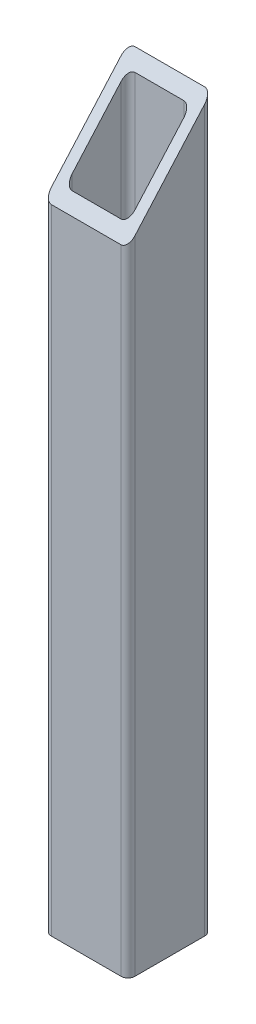
ISO-10303-21;
HEADER;
FILE_DESCRIPTION(('STEP AP214'),'2;1');
FILE_NAME('part.step','',(''),(''),'','','');
FILE_SCHEMA(('AUTOMOTIVE_DESIGN { 1 0 10303 214 1 1 1 1 }'));
ENDSEC;
DATA;
#1=APPLICATION_CONTEXT('core data for automotive mechanical design processes');
#2=APPLICATION_PROTOCOL_DEFINITION('international standard','automotive_design',2000,#1);
#3=PRODUCT_CONTEXT('',#1,'mechanical');
#4=PRODUCT('Part','Part','',(#3));
#5=PRODUCT_RELATED_PRODUCT_CATEGORY('part','',(#4));
#6=PRODUCT_DEFINITION_FORMATION('','',#4);
#7=PRODUCT_DEFINITION_CONTEXT('part definition',#1,'design');
#8=PRODUCT_DEFINITION('design','',#6,#7);
#9=PRODUCT_DEFINITION_SHAPE('','',#8);
#10=(LENGTH_UNIT() NAMED_UNIT(*) SI_UNIT(.MILLI.,.METRE.));
#11=(NAMED_UNIT(*) PLANE_ANGLE_UNIT() SI_UNIT($,.RADIAN.));
#12=(NAMED_UNIT(*) SI_UNIT($,.STERADIAN.) SOLID_ANGLE_UNIT());
#13=UNCERTAINTY_MEASURE_WITH_UNIT(LENGTH_MEASURE(1.E-05),#10,'distance_accuracy_value','');
#14=(GEOMETRIC_REPRESENTATION_CONTEXT(3) GLOBAL_UNCERTAINTY_ASSIGNED_CONTEXT((#13)) GLOBAL_UNIT_ASSIGNED_CONTEXT((#10,
#11,#12)) REPRESENTATION_CONTEXT('',''));
#15=CARTESIAN_POINT('',(0.,0.,0.));
#16=DIRECTION('',(0.,0.,1.));
#17=DIRECTION('',(1.,0.,0.));
#18=AXIS2_PLACEMENT_3D('',#15,#16,#17);
#19=CARTESIAN_POINT('',(-12.7,1219.2,12.7));
#20=DIRECTION('',(1.,0.,0.));
#21=DIRECTION('',(0.,0.,-1.));
#22=AXIS2_PLACEMENT_3D('',#19,#20,#21);
#23=PLANE('',#22);
#24=DIRECTION('',(0.,-1.,0.));
#25=VECTOR('',#24,1.);
#26=CARTESIAN_POINT('',(-12.7,1219.2,10.5918));
#27=LINE('',#26,#25);
#28=CARTESIAN_POINT('',(-12.7,0.,10.5918));
#29=VERTEX_POINT('',#28);
#30=CARTESIAN_POINT('',(-12.7,194.680595204069,10.5917999999999));
#31=VERTEX_POINT('',#30);
#32=EDGE_CURVE('E176',#29,#31,#27,.F.);
#33=ORIENTED_EDGE('',*,*,#32,.T.);
#34=DIRECTION('',(0.,0.75,-0.661437827766148));
#35=VECTOR('',#34,1.);
#36=CARTESIAN_POINT('',(-12.7,-9.61997822454396,190.76797));
#37=LINE('',#36,#35);
#38=CARTESIAN_POINT('',(-12.7,218.700539835383,-10.5917999999999));
#39=VERTEX_POINT('',#38);
#40=EDGE_CURVE('E168',#31,#39,#37,.T.);
#41=ORIENTED_EDGE('',*,*,#40,.T.);
#42=DIRECTION('',(0.,-1.,0.));
#43=VECTOR('',#42,1.);
#44=CARTESIAN_POINT('',(-12.7,1219.2,-10.5918));
#45=LINE('',#44,#43);
#46=CARTESIAN_POINT('',(-12.7,0.,-10.5918));
#47=VERTEX_POINT('',#46);
#48=EDGE_CURVE('E186',#39,#47,#45,.T.);
#49=ORIENTED_EDGE('',*,*,#48,.T.);
#50=DIRECTION('',(0.,0.,1.));
#51=VECTOR('',#50,1.);
#52=CARTESIAN_POINT('',(-12.7,0.,12.7));
#53=LINE('',#52,#51);
#54=EDGE_CURVE('E278',#47,#29,#53,.T.);
#55=ORIENTED_EDGE('',*,*,#54,.T.);
#56=EDGE_LOOP('',(#33,#41,#49,#55));
#57=FACE_BOUND('',#56,.T.);
#58=ADVANCED_FACE('F41',(#57),#23,.F.);
#59=CARTESIAN_POINT('',(12.7,1219.2,12.7));
#60=DIRECTION('',(0.,0.,-1.));
#61=DIRECTION('',(-1.,0.,0.));
#62=AXIS2_PLACEMENT_3D('',#59,#60,#61);
#63=PLANE('',#62);
#64=DIRECTION('',(0.,-1.,0.));
#65=VECTOR('',#64,1.);
#66=CARTESIAN_POINT('',(10.5918,1219.2,12.7));
#67=LINE('',#66,#65);
#68=CARTESIAN_POINT('',(10.5918,0.,12.7));
#69=VERTEX_POINT('',#68);
#70=CARTESIAN_POINT('',(10.5918,192.290121098075,12.7));
#71=VERTEX_POINT('',#70);
#72=EDGE_CURVE('E189',#69,#71,#67,.F.);
#73=ORIENTED_EDGE('',*,*,#72,.T.);
#74=DIRECTION('',(-1.,0.,0.));
#75=VECTOR('',#74,1.);
#76=CARTESIAN_POINT('',(12.7000000000002,192.290121098075,12.7));
#77=LINE('',#76,#75);
#78=CARTESIAN_POINT('',(-10.5918,192.290121098075,12.7));
#79=VERTEX_POINT('',#78);
#80=EDGE_CURVE('E64',#71,#79,#77,.T.);
#81=ORIENTED_EDGE('',*,*,#80,.T.);
#82=DIRECTION('',(0.,-1.,0.));
#83=VECTOR('',#82,1.);
#84=CARTESIAN_POINT('',(-10.5918,1219.2,12.7));
#85=LINE('',#84,#83);
#86=CARTESIAN_POINT('',(-10.5918,0.,12.7));
#87=VERTEX_POINT('',#86);
#88=EDGE_CURVE('E192',#79,#87,#85,.T.);
#89=ORIENTED_EDGE('',*,*,#88,.T.);
#90=DIRECTION('',(1.,0.,0.));
#91=VECTOR('',#90,1.);
#92=CARTESIAN_POINT('',(12.7,0.,12.7));
#93=LINE('',#92,#91);
#94=EDGE_CURVE('E339',#87,#69,#93,.T.);
#95=ORIENTED_EDGE('',*,*,#94,.T.);
#96=EDGE_LOOP('',(#73,#81,#89,#95));
#97=FACE_BOUND('',#96,.T.);
#98=ADVANCED_FACE('F356',(#97),#63,.F.);
#99=CARTESIAN_POINT('',(12.7,1219.2,12.7));
#100=DIRECTION('',(-1.,0.,0.));
#101=DIRECTION('',(0.,0.,1.));
#102=AXIS2_PLACEMENT_3D('',#99,#100,#101);
#103=PLANE('',#102);
#104=DIRECTION('',(0.,-1.,0.));
#105=VECTOR('',#104,1.);
#106=CARTESIAN_POINT('',(12.7,1219.2,-10.5918));
#107=LINE('',#106,#105);
#108=CARTESIAN_POINT('',(12.7,0.,-10.5918));
#109=VERTEX_POINT('',#108);
#110=CARTESIAN_POINT('',(12.7,218.700539835383,-10.5918));
#111=VERTEX_POINT('',#110);
#112=EDGE_CURVE('E166',#109,#111,#107,.F.);
#113=ORIENTED_EDGE('',*,*,#112,.T.);
#114=DIRECTION('',(0.,0.75,-0.661437827766148));
#115=VECTOR('',#114,1.);
#116=CARTESIAN_POINT('',(12.7,218.980021775456,-10.8382799031219));
#117=LINE('',#116,#115);
#118=CARTESIAN_POINT('',(12.7,194.680595204069,10.5918));
#119=VERTEX_POINT('',#118);
#120=EDGE_CURVE('E153',#119,#111,#117,.T.);
#121=ORIENTED_EDGE('',*,*,#120,.F.);
#122=DIRECTION('',(0.,-1.,0.));
#123=VECTOR('',#122,1.);
#124=CARTESIAN_POINT('',(12.7,1219.2,10.5918));
#125=LINE('',#124,#123);
#126=CARTESIAN_POINT('',(12.7,0.,10.5918));
#127=VERTEX_POINT('',#126);
#128=EDGE_CURVE('E163',#119,#127,#125,.T.);
#129=ORIENTED_EDGE('',*,*,#128,.T.);
#130=DIRECTION('',(0.,0.,-1.));
#131=VECTOR('',#130,1.);
#132=CARTESIAN_POINT('',(12.7,0.,12.7));
#133=LINE('',#132,#131);
#134=EDGE_CURVE('E237',#127,#109,#133,.T.);
#135=ORIENTED_EDGE('',*,*,#134,.T.);
#136=EDGE_LOOP('',(#113,#121,#129,#135));
#137=FACE_BOUND('',#136,.T.);
#138=ADVANCED_FACE('F161',(#137),#103,.F.);
#139=CARTESIAN_POINT('',(12.7,1219.2,-12.7));
#140=DIRECTION('',(0.,0.,1.));
#141=DIRECTION('',(1.,0.,0.));
#142=AXIS2_PLACEMENT_3D('',#139,#140,#141);
#143=PLANE('',#142);
#144=DIRECTION('',(0.,-1.,0.));
#145=VECTOR('',#144,1.);
#146=CARTESIAN_POINT('',(-10.5918,1219.2,-12.7));
#147=LINE('',#146,#145);
#148=CARTESIAN_POINT('',(-10.5918,0.,-12.7));
#149=VERTEX_POINT('',#148);
#150=CARTESIAN_POINT('',(-10.5918,221.091013941378,-12.7));
#151=VERTEX_POINT('',#150);
#152=EDGE_CURVE('E261',#149,#151,#147,.F.);
#153=ORIENTED_EDGE('',*,*,#152,.T.);
#154=DIRECTION('',(1.,0.,0.));
#155=VECTOR('',#154,1.);
#156=CARTESIAN_POINT('',(12.7000000000002,221.091013941378,-12.7));
#157=LINE('',#156,#155);
#158=CARTESIAN_POINT('',(10.5918,221.091013941378,-12.7));
#159=VERTEX_POINT('',#158);
#160=EDGE_CURVE('E292',#151,#159,#157,.T.);
#161=ORIENTED_EDGE('',*,*,#160,.T.);
#162=DIRECTION('',(0.,-1.,0.));
#163=VECTOR('',#162,1.);
#164=CARTESIAN_POINT('',(10.5918,1219.2,-12.7));
#165=LINE('',#164,#163);
#166=CARTESIAN_POINT('',(10.5918,0.,-12.7));
#167=VERTEX_POINT('',#166);
#168=EDGE_CURVE('E265',#159,#167,#165,.T.);
#169=ORIENTED_EDGE('',*,*,#168,.T.);
#170=DIRECTION('',(-1.,0.,0.));
#171=VECTOR('',#170,1.);
#172=CARTESIAN_POINT('',(12.7,0.,-12.7));
#173=LINE('',#172,#171);
#174=EDGE_CURVE('E230',#167,#149,#173,.T.);
#175=ORIENTED_EDGE('',*,*,#174,.T.);
#176=EDGE_LOOP('',(#153,#161,#169,#175));
#177=FACE_BOUND('',#176,.T.);
#178=ADVANCED_FACE('F283',(#177),#143,.F.);
#179=CARTESIAN_POINT('',(9.525,1219.2,9.525));
#180=DIRECTION('',(-1.,0.,0.));
#181=DIRECTION('',(0.,0.,1.));
#182=AXIS2_PLACEMENT_3D('',#179,#180,#181);
#183=PLANE('',#182);
#184=DIRECTION('',(0.,-0.75,0.661437827766148));
#185=VECTOR('',#184,1.);
#186=CARTESIAN_POINT('',(9.525,771.501976807776,-498.116842209365));
#187=LINE('',#186,#185);
#188=CARTESIAN_POINT('',(9.525,215.100428229971,-7.41679999999995));
#189=VERTEX_POINT('',#188);
#190=CARTESIAN_POINT('',(9.525,198.280706809482,7.4168));
#191=VERTEX_POINT('',#190);
#192=EDGE_CURVE('E57',#189,#191,#187,.T.);
#193=ORIENTED_EDGE('',*,*,#192,.F.);
#194=DIRECTION('',(0.,-1.,0.));
#195=VECTOR('',#194,1.);
#196=CARTESIAN_POINT('',(9.525,0.,-7.4168));
#197=LINE('',#196,#195);
#198=CARTESIAN_POINT('',(9.525,0.,-7.4168));
#199=VERTEX_POINT('',#198);
#200=EDGE_CURVE('E221',#189,#199,#197,.T.);
#201=ORIENTED_EDGE('',*,*,#200,.T.);
#202=DIRECTION('',(0.,0.,-1.));
#203=VECTOR('',#202,1.);
#204=CARTESIAN_POINT('',(9.525,0.,9.525));
#205=LINE('',#204,#203);
#206=CARTESIAN_POINT('',(9.525,0.,7.4168));
#207=VERTEX_POINT('',#206);
#208=EDGE_CURVE('E210',#207,#199,#205,.T.);
#209=ORIENTED_EDGE('',*,*,#208,.F.);
#210=DIRECTION('',(0.,-1.,0.));
#211=VECTOR('',#210,1.);
#212=CARTESIAN_POINT('',(9.525,1219.2,7.4168));
#213=LINE('',#212,#211);
#214=EDGE_CURVE('E219',#207,#191,#213,.F.);
#215=ORIENTED_EDGE('',*,*,#214,.T.);
#216=EDGE_LOOP('',(#193,#201,#209,#215));
#217=FACE_BOUND('',#216,.T.);
#218=ADVANCED_FACE('F218',(#217),#183,.T.);
#219=CARTESIAN_POINT('',(9.525,1219.2,-9.525));
#220=DIRECTION('',(0.,0.,1.));
#221=DIRECTION('',(1.,0.,0.));
#222=AXIS2_PLACEMENT_3D('',#219,#220,#221);
#223=PLANE('',#222);
#224=DIRECTION('',(1.,0.,0.));
#225=VECTOR('',#224,1.);
#226=CARTESIAN_POINT('',(9.5250000000002,217.490902335965,-9.525));
#227=LINE('',#226,#225);
#228=CARTESIAN_POINT('',(-7.4168,217.490902335965,-9.525));
#229=VERTEX_POINT('',#228);
#230=CARTESIAN_POINT('',(7.4168,217.490902335965,-9.525));
#231=VERTEX_POINT('',#230);
#232=EDGE_CURVE('E322',#229,#231,#227,.T.);
#233=ORIENTED_EDGE('',*,*,#232,.F.);
#234=DIRECTION('',(0.,-1.,0.));
#235=VECTOR('',#234,1.);
#236=CARTESIAN_POINT('',(-7.4168,0.,-9.525));
#237=LINE('',#236,#235);
#238=CARTESIAN_POINT('',(-7.4168,0.,-9.525));
#239=VERTEX_POINT('',#238);
#240=EDGE_CURVE('E234',#229,#239,#237,.T.);
#241=ORIENTED_EDGE('',*,*,#240,.T.);
#242=DIRECTION('',(-1.,0.,0.));
#243=VECTOR('',#242,1.);
#244=CARTESIAN_POINT('',(9.525,0.,-9.525));
#245=LINE('',#244,#243);
#246=CARTESIAN_POINT('',(7.4168,0.,-9.525));
#247=VERTEX_POINT('',#246);
#248=EDGE_CURVE('E224',#247,#239,#245,.T.);
#249=ORIENTED_EDGE('',*,*,#248,.F.);
#250=DIRECTION('',(0.,-1.,0.));
#251=VECTOR('',#250,1.);
#252=CARTESIAN_POINT('',(7.4168,1219.2,-9.525));
#253=LINE('',#252,#251);
#254=EDGE_CURVE('E243',#247,#231,#253,.F.);
#255=ORIENTED_EDGE('',*,*,#254,.T.);
#256=EDGE_LOOP('',(#233,#241,#249,#255));
#257=FACE_BOUND('',#256,.T.);
#258=ADVANCED_FACE('F393',(#257),#223,.T.);
#259=CARTESIAN_POINT('',(-9.525,1219.2,9.525));
#260=DIRECTION('',(1.,0.,0.));
#261=DIRECTION('',(0.,0.,-1.));
#262=AXIS2_PLACEMENT_3D('',#259,#260,#261);
#263=PLANE('',#262);
#264=DIRECTION('',(0.,0.75,-0.661437827766148));
#265=VECTOR('',#264,1.);
#266=CARTESIAN_POINT('',(-9.52499999999996,771.501976807776,-498.116842209365));
#267=LINE('',#266,#265);
#268=CARTESIAN_POINT('',(-9.525,198.280706809482,7.4168));
#269=VERTEX_POINT('',#268);
#270=CARTESIAN_POINT('',(-9.525,215.100428229971,-7.41679999999995));
#271=VERTEX_POINT('',#270);
#272=EDGE_CURVE('E319',#269,#271,#267,.T.);
#273=ORIENTED_EDGE('',*,*,#272,.F.);
#274=DIRECTION('',(0.,-1.,0.));
#275=VECTOR('',#274,1.);
#276=CARTESIAN_POINT('',(-9.525,0.,7.4168));
#277=LINE('',#276,#275);
#278=CARTESIAN_POINT('',(-9.525,0.,7.4168));
#279=VERTEX_POINT('',#278);
#280=EDGE_CURVE('E247',#269,#279,#277,.T.);
#281=ORIENTED_EDGE('',*,*,#280,.T.);
#282=DIRECTION('',(0.,0.,1.));
#283=VECTOR('',#282,1.);
#284=CARTESIAN_POINT('',(-9.525,0.,9.525));
#285=LINE('',#284,#283);
#286=CARTESIAN_POINT('',(-9.525,0.,-7.4168));
#287=VERTEX_POINT('',#286);
#288=EDGE_CURVE('E331',#287,#279,#285,.T.);
#289=ORIENTED_EDGE('',*,*,#288,.F.);
#290=DIRECTION('',(0.,-1.,0.));
#291=VECTOR('',#290,1.);
#292=CARTESIAN_POINT('',(-9.525,1219.2,-7.4168));
#293=LINE('',#292,#291);
#294=EDGE_CURVE('E250',#287,#271,#293,.F.);
#295=ORIENTED_EDGE('',*,*,#294,.T.);
#296=EDGE_LOOP('',(#273,#281,#289,#295));
#297=FACE_BOUND('',#296,.T.);
#298=ADVANCED_FACE('F386',(#297),#263,.T.);
#299=CARTESIAN_POINT('',(9.525,1219.2,9.525));
#300=DIRECTION('',(0.,0.,-1.));
#301=DIRECTION('',(-1.,0.,0.));
#302=AXIS2_PLACEMENT_3D('',#299,#300,#301);
#303=PLANE('',#302);
#304=DIRECTION('',(-1.,0.,0.));
#305=VECTOR('',#304,1.);
#306=CARTESIAN_POINT('',(9.52500000000021,195.890232703488,9.525));
#307=LINE('',#306,#305);
#308=CARTESIAN_POINT('',(7.4168,195.890232703487,9.525));
#309=VERTEX_POINT('',#308);
#310=CARTESIAN_POINT('',(-7.4168,195.890232703488,9.525));
#311=VERTEX_POINT('',#310);
#312=EDGE_CURVE('E306',#309,#311,#307,.T.);
#313=ORIENTED_EDGE('',*,*,#312,.F.);
#314=DIRECTION('',(0.,-1.,0.));
#315=VECTOR('',#314,1.);
#316=CARTESIAN_POINT('',(7.4168,0.,9.525));
#317=LINE('',#316,#315);
#318=CARTESIAN_POINT('',(7.4168,0.,9.525));
#319=VERTEX_POINT('',#318);
#320=EDGE_CURVE('E254',#309,#319,#317,.T.);
#321=ORIENTED_EDGE('',*,*,#320,.T.);
#322=DIRECTION('',(1.,0.,0.));
#323=VECTOR('',#322,1.);
#324=CARTESIAN_POINT('',(9.525,0.,9.525));
#325=LINE('',#324,#323);
#326=CARTESIAN_POINT('',(-7.4168,0.,9.525));
#327=VERTEX_POINT('',#326);
#328=EDGE_CURVE('E212',#327,#319,#325,.T.);
#329=ORIENTED_EDGE('',*,*,#328,.F.);
#330=DIRECTION('',(0.,-1.,0.));
#331=VECTOR('',#330,1.);
#332=CARTESIAN_POINT('',(-7.4168,1219.2,9.525));
#333=LINE('',#332,#331);
#334=EDGE_CURVE('E257',#327,#311,#333,.F.);
#335=ORIENTED_EDGE('',*,*,#334,.T.);
#336=EDGE_LOOP('',(#313,#321,#329,#335));
#337=FACE_BOUND('',#336,.T.);
#338=ADVANCED_FACE('F371',(#337),#303,.T.);
#339=CARTESIAN_POINT('',(7.4168,1219.2,-7.4168));
#340=DIRECTION('',(0.,1.,0.));
#341=DIRECTION('',(0.,0.,1.));
#342=AXIS2_PLACEMENT_3D('',#339,#340,#341);
#343=CYLINDRICAL_SURFACE('',#342,2.1082);
#344=ORIENTED_EDGE('',*,*,#200,.F.);
#345=CARTESIAN_POINT('',(7.4168,215.100428229971,-7.4168));
#346=DIRECTION('',(0.,-0.661437827766148,-0.75));
#347=DIRECTION('',(0.,0.75,-0.661437827766148));
#348=AXIS2_PLACEMENT_3D('',#345,#346,#347);
#349=ELLIPSE('',#348,3.18729880799221,2.1082);
#350=EDGE_CURVE('E315',#189,#231,#349,.F.);
#351=ORIENTED_EDGE('',*,*,#350,.T.);
#352=ORIENTED_EDGE('',*,*,#254,.F.);
#353=CARTESIAN_POINT('',(7.4168,0.,-7.4168));
#354=DIRECTION('',(0.,1.,0.));
#355=DIRECTION('',(0.,0.,1.));
#356=AXIS2_PLACEMENT_3D('',#353,#354,#355);
#357=CIRCLE('',#356,2.1082);
#358=EDGE_CURVE('E195',#199,#247,#357,.T.);
#359=ORIENTED_EDGE('',*,*,#358,.F.);
#360=EDGE_LOOP('',(#344,#351,#352,#359));
#361=FACE_BOUND('',#360,.T.);
#362=ADVANCED_FACE('F367',(#361),#343,.F.);
#363=CARTESIAN_POINT('',(-7.4168,1219.2,-7.4168));
#364=DIRECTION('',(0.,1.,0.));
#365=DIRECTION('',(0.,0.,1.));
#366=AXIS2_PLACEMENT_3D('',#363,#364,#365);
#367=CYLINDRICAL_SURFACE('',#366,2.1082);
#368=ORIENTED_EDGE('',*,*,#240,.F.);
#369=CARTESIAN_POINT('',(-7.4168,215.100428229971,-7.4168));
#370=DIRECTION('',(0.,-0.661437827766148,-0.75));
#371=DIRECTION('',(0.,0.75,-0.661437827766148));
#372=AXIS2_PLACEMENT_3D('',#369,#370,#371);
#373=ELLIPSE('',#372,3.18729880799221,2.1082);
#374=EDGE_CURVE('E225',#229,#271,#373,.F.);
#375=ORIENTED_EDGE('',*,*,#374,.T.);
#376=ORIENTED_EDGE('',*,*,#294,.F.);
#377=CARTESIAN_POINT('',(-7.4168,0.,-7.4168));
#378=DIRECTION('',(0.,1.,0.));
#379=DIRECTION('',(0.,0.,1.));
#380=AXIS2_PLACEMENT_3D('',#377,#378,#379);
#381=CIRCLE('',#380,2.1082);
#382=EDGE_CURVE('E198',#239,#287,#381,.T.);
#383=ORIENTED_EDGE('',*,*,#382,.F.);
#384=EDGE_LOOP('',(#368,#375,#376,#383));
#385=FACE_BOUND('',#384,.T.);
#386=ADVANCED_FACE('F370',(#385),#367,.F.);
#387=CARTESIAN_POINT('',(-7.4168,1219.2,7.4168));
#388=DIRECTION('',(0.,1.,0.));
#389=DIRECTION('',(0.,0.,1.));
#390=AXIS2_PLACEMENT_3D('',#387,#388,#389);
#391=CYLINDRICAL_SURFACE('',#390,2.1082);
#392=ORIENTED_EDGE('',*,*,#280,.F.);
#393=CARTESIAN_POINT('',(-7.4168,198.280706809482,7.4168));
#394=DIRECTION('',(0.,-0.661437827766148,-0.75));
#395=DIRECTION('',(0.,0.75,-0.661437827766148));
#396=AXIS2_PLACEMENT_3D('',#393,#394,#395);
#397=ELLIPSE('',#396,3.18729880799221,2.1082);
#398=EDGE_CURVE('E311',#269,#311,#397,.F.);
#399=ORIENTED_EDGE('',*,*,#398,.T.);
#400=ORIENTED_EDGE('',*,*,#334,.F.);
#401=CARTESIAN_POINT('',(-7.4168,0.,7.4168));
#402=DIRECTION('',(0.,1.,0.));
#403=DIRECTION('',(0.,0.,1.));
#404=AXIS2_PLACEMENT_3D('',#401,#402,#403);
#405=CIRCLE('',#404,2.1082);
#406=EDGE_CURVE('E201',#279,#327,#405,.T.);
#407=ORIENTED_EDGE('',*,*,#406,.F.);
#408=EDGE_LOOP('',(#392,#399,#400,#407));
#409=FACE_BOUND('',#408,.T.);
#410=ADVANCED_FACE('F353',(#409),#391,.F.);
#411=CARTESIAN_POINT('',(7.4168,1219.2,7.4168));
#412=DIRECTION('',(0.,1.,0.));
#413=DIRECTION('',(0.,0.,1.));
#414=AXIS2_PLACEMENT_3D('',#411,#412,#413);
#415=CYLINDRICAL_SURFACE('',#414,2.1082);
#416=ORIENTED_EDGE('',*,*,#320,.F.);
#417=CARTESIAN_POINT('',(7.4168,198.280706809482,7.4168));
#418=DIRECTION('',(0.,-0.661437827766148,-0.75));
#419=DIRECTION('',(0.,0.75,-0.661437827766148));
#420=AXIS2_PLACEMENT_3D('',#417,#418,#419);
#421=ELLIPSE('',#420,3.18729880799221,2.1082);
#422=EDGE_CURVE('E228',#309,#191,#421,.F.);
#423=ORIENTED_EDGE('',*,*,#422,.T.);
#424=ORIENTED_EDGE('',*,*,#214,.F.);
#425=CARTESIAN_POINT('',(7.4168,0.,7.4168));
#426=DIRECTION('',(0.,1.,0.));
#427=DIRECTION('',(0.,0.,1.));
#428=AXIS2_PLACEMENT_3D('',#425,#426,#427);
#429=CIRCLE('',#428,2.1082);
#430=EDGE_CURVE('E50',#319,#207,#429,.T.);
#431=ORIENTED_EDGE('',*,*,#430,.F.);
#432=EDGE_LOOP('',(#416,#423,#424,#431));
#433=FACE_BOUND('',#432,.T.);
#434=ADVANCED_FACE('F227',(#433),#415,.F.);
#435=CARTESIAN_POINT('',(10.5918,1219.2,-10.5918));
#436=DIRECTION('',(0.,-1.,0.));
#437=DIRECTION('',(0.,0.,-1.));
#438=AXIS2_PLACEMENT_3D('',#435,#436,#437);
#439=CYLINDRICAL_SURFACE('',#438,2.1082);
#440=CARTESIAN_POINT('',(10.5918,218.700539835384,-10.5918));
#441=DIRECTION('',(0.,-0.661437827766148,-0.75));
#442=DIRECTION('',(0.,-0.75,0.661437827766148));
#443=AXIS2_PLACEMENT_3D('',#440,#441,#442);
#444=ELLIPSE('',#443,3.18729880799221,2.1082);
#445=EDGE_CURVE('E297',#111,#159,#444,.F.);
#446=ORIENTED_EDGE('',*,*,#445,.F.);
#447=ORIENTED_EDGE('',*,*,#112,.F.);
#448=CARTESIAN_POINT('',(10.5918,0.,-10.5918));
#449=DIRECTION('',(0.,1.,0.));
#450=DIRECTION('',(0.,0.,1.));
#451=AXIS2_PLACEMENT_3D('',#448,#449,#450);
#452=CIRCLE('',#451,2.1082);
#453=EDGE_CURVE('E173',#167,#109,#452,.F.);
#454=ORIENTED_EDGE('',*,*,#453,.F.);
#455=ORIENTED_EDGE('',*,*,#168,.F.);
#456=EDGE_LOOP('',(#446,#447,#454,#455));
#457=FACE_BOUND('',#456,.T.);
#458=ADVANCED_FACE('F344',(#457),#439,.T.);
#459=CARTESIAN_POINT('',(-10.5918,1219.2,-10.5918));
#460=DIRECTION('',(0.,-1.,0.));
#461=DIRECTION('',(0.,0.,-1.));
#462=AXIS2_PLACEMENT_3D('',#459,#460,#461);
#463=CYLINDRICAL_SURFACE('',#462,2.1082);
#464=CARTESIAN_POINT('',(-10.5918,218.700539835384,-10.5918));
#465=DIRECTION('',(0.,-0.661437827766148,-0.75));
#466=DIRECTION('',(0.,-0.75,0.661437827766148));
#467=AXIS2_PLACEMENT_3D('',#464,#465,#466);
#468=ELLIPSE('',#467,3.18729880799221,2.1082);
#469=EDGE_CURVE('E289',#151,#39,#468,.F.);
#470=ORIENTED_EDGE('',*,*,#469,.F.);
#471=ORIENTED_EDGE('',*,*,#152,.F.);
#472=CARTESIAN_POINT('',(-10.5918,0.,-10.5918));
#473=DIRECTION('',(0.,1.,0.));
#474=DIRECTION('',(0.,0.,1.));
#475=AXIS2_PLACEMENT_3D('',#472,#473,#474);
#476=CIRCLE('',#475,2.1082);
#477=EDGE_CURVE('E178',#47,#149,#476,.F.);
#478=ORIENTED_EDGE('',*,*,#477,.F.);
#479=ORIENTED_EDGE('',*,*,#48,.F.);
#480=EDGE_LOOP('',(#470,#471,#478,#479));
#481=FACE_BOUND('',#480,.T.);
#482=ADVANCED_FACE('F288',(#481),#463,.T.);
#483=CARTESIAN_POINT('',(-10.5918,1219.2,10.5918));
#484=DIRECTION('',(0.,-1.,0.));
#485=DIRECTION('',(0.,0.,-1.));
#486=AXIS2_PLACEMENT_3D('',#483,#484,#485);
#487=CYLINDRICAL_SURFACE('',#486,2.1082);
#488=CARTESIAN_POINT('',(-10.5918,194.680595204069,10.5918));
#489=DIRECTION('',(0.,-0.661437827766148,-0.75));
#490=DIRECTION('',(0.,-0.75,0.661437827766148));
#491=AXIS2_PLACEMENT_3D('',#488,#489,#490);
#492=ELLIPSE('',#491,3.18729880799221,2.1082);
#493=EDGE_CURVE('E293',#31,#79,#492,.F.);
#494=ORIENTED_EDGE('',*,*,#493,.F.);
#495=ORIENTED_EDGE('',*,*,#32,.F.);
#496=CARTESIAN_POINT('',(-10.5918,0.,10.5918));
#497=DIRECTION('',(0.,1.,0.));
#498=DIRECTION('',(0.,0.,1.));
#499=AXIS2_PLACEMENT_3D('',#496,#497,#498);
#500=CIRCLE('',#499,2.1082);
#501=EDGE_CURVE('E270',#87,#29,#500,.F.);
#502=ORIENTED_EDGE('',*,*,#501,.F.);
#503=ORIENTED_EDGE('',*,*,#88,.F.);
#504=EDGE_LOOP('',(#494,#495,#502,#503));
#505=FACE_BOUND('',#504,.T.);
#506=ADVANCED_FACE('F351',(#505),#487,.T.);
#507=CARTESIAN_POINT('',(10.5918,1219.2,10.5918));
#508=DIRECTION('',(0.,-1.,0.));
#509=DIRECTION('',(0.,0.,-1.));
#510=AXIS2_PLACEMENT_3D('',#507,#508,#509);
#511=CYLINDRICAL_SURFACE('',#510,2.1082);
#512=CARTESIAN_POINT('',(10.5918,194.680595204069,10.5918));
#513=DIRECTION('',(0.,-0.661437827766148,-0.75));
#514=DIRECTION('',(0.,-0.75,0.661437827766148));
#515=AXIS2_PLACEMENT_3D('',#512,#513,#514);
#516=ELLIPSE('',#515,3.18729880799221,2.1082);
#517=EDGE_CURVE('E13',#71,#119,#516,.F.);
#518=ORIENTED_EDGE('',*,*,#517,.F.);
#519=ORIENTED_EDGE('',*,*,#72,.F.);
#520=CARTESIAN_POINT('',(10.5918,0.,10.5918));
#521=DIRECTION('',(0.,1.,0.));
#522=DIRECTION('',(0.,0.,1.));
#523=AXIS2_PLACEMENT_3D('',#520,#521,#522);
#524=CIRCLE('',#523,2.1082);
#525=EDGE_CURVE('E170',#127,#69,#524,.F.);
#526=ORIENTED_EDGE('',*,*,#525,.F.);
#527=ORIENTED_EDGE('',*,*,#128,.F.);
#528=EDGE_LOOP('',(#518,#519,#526,#527));
#529=FACE_BOUND('',#528,.T.);
#530=ADVANCED_FACE('F43',(#529),#511,.T.);
#531=CARTESIAN_POINT('',(0.,0.,0.));
#532=DIRECTION('',(0.,1.,0.));
#533=DIRECTION('',(0.,0.,1.));
#534=AXIS2_PLACEMENT_3D('',#531,#532,#533);
#535=PLANE('',#534);
#536=ORIENTED_EDGE('',*,*,#174,.F.);
#537=ORIENTED_EDGE('',*,*,#453,.T.);
#538=ORIENTED_EDGE('',*,*,#134,.F.);
#539=ORIENTED_EDGE('',*,*,#525,.T.);
#540=ORIENTED_EDGE('',*,*,#94,.F.);
#541=ORIENTED_EDGE('',*,*,#501,.T.);
#542=ORIENTED_EDGE('',*,*,#54,.F.);
#543=ORIENTED_EDGE('',*,*,#477,.T.);
#544=EDGE_LOOP('',(#536,#537,#538,#539,#540,#541,#542,#543));
#545=FACE_BOUND('',#544,.T.);
#546=ORIENTED_EDGE('',*,*,#328,.T.);
#547=ORIENTED_EDGE('',*,*,#430,.T.);
#548=ORIENTED_EDGE('',*,*,#208,.T.);
#549=ORIENTED_EDGE('',*,*,#358,.T.);
#550=ORIENTED_EDGE('',*,*,#248,.T.);
#551=ORIENTED_EDGE('',*,*,#382,.T.);
#552=ORIENTED_EDGE('',*,*,#288,.T.);
#553=ORIENTED_EDGE('',*,*,#406,.T.);
#554=EDGE_LOOP('',(#546,#547,#548,#549,#550,#551,#552,#553));
#555=FACE_BOUND('',#554,.T.);
#556=ADVANCED_FACE('F209',(#545,#555),#535,.F.);
#557=CARTESIAN_POINT('',(-12.7,218.980021775456,-10.8382799031219));
#558=DIRECTION('',(0.,-0.661437827766148,-0.75));
#559=DIRECTION('',(0.,0.75,-0.661437827766148));
#560=AXIS2_PLACEMENT_3D('',#557,#558,#559);
#561=PLANE('',#560);
#562=ORIENTED_EDGE('',*,*,#445,.T.);
#563=ORIENTED_EDGE('',*,*,#160,.F.);
#564=ORIENTED_EDGE('',*,*,#469,.T.);
#565=ORIENTED_EDGE('',*,*,#40,.F.);
#566=ORIENTED_EDGE('',*,*,#493,.T.);
#567=ORIENTED_EDGE('',*,*,#80,.F.);
#568=ORIENTED_EDGE('',*,*,#517,.T.);
#569=ORIENTED_EDGE('',*,*,#120,.T.);
#570=EDGE_LOOP('',(#562,#563,#564,#565,#566,#567,#568,#569));
#571=FACE_BOUND('',#570,.T.);
#572=ORIENTED_EDGE('',*,*,#232,.T.);
#573=ORIENTED_EDGE('',*,*,#350,.F.);
#574=ORIENTED_EDGE('',*,*,#192,.T.);
#575=ORIENTED_EDGE('',*,*,#422,.F.);
#576=ORIENTED_EDGE('',*,*,#312,.T.);
#577=ORIENTED_EDGE('',*,*,#398,.F.);
#578=ORIENTED_EDGE('',*,*,#272,.T.);
#579=ORIENTED_EDGE('',*,*,#374,.F.);
#580=EDGE_LOOP('',(#572,#573,#574,#575,#576,#577,#578,#579));
#581=FACE_BOUND('',#580,.T.);
#582=ADVANCED_FACE('F152',(#571,#581),#561,.F.);
#583=CLOSED_SHELL('',(#58,#98,#138,#178,#218,#258,#298,#338,#362,#386,#410,#434,#458,#482,#506,
#530,#556,#582));
#584=MANIFOLD_SOLID_BREP('B2',#583);
#585=ADVANCED_BREP_SHAPE_REPRESENTATION('',(#18,#584),#14);
#586=SHAPE_DEFINITION_REPRESENTATION(#9,#585);
ENDSEC;
END-ISO-10303-21;
